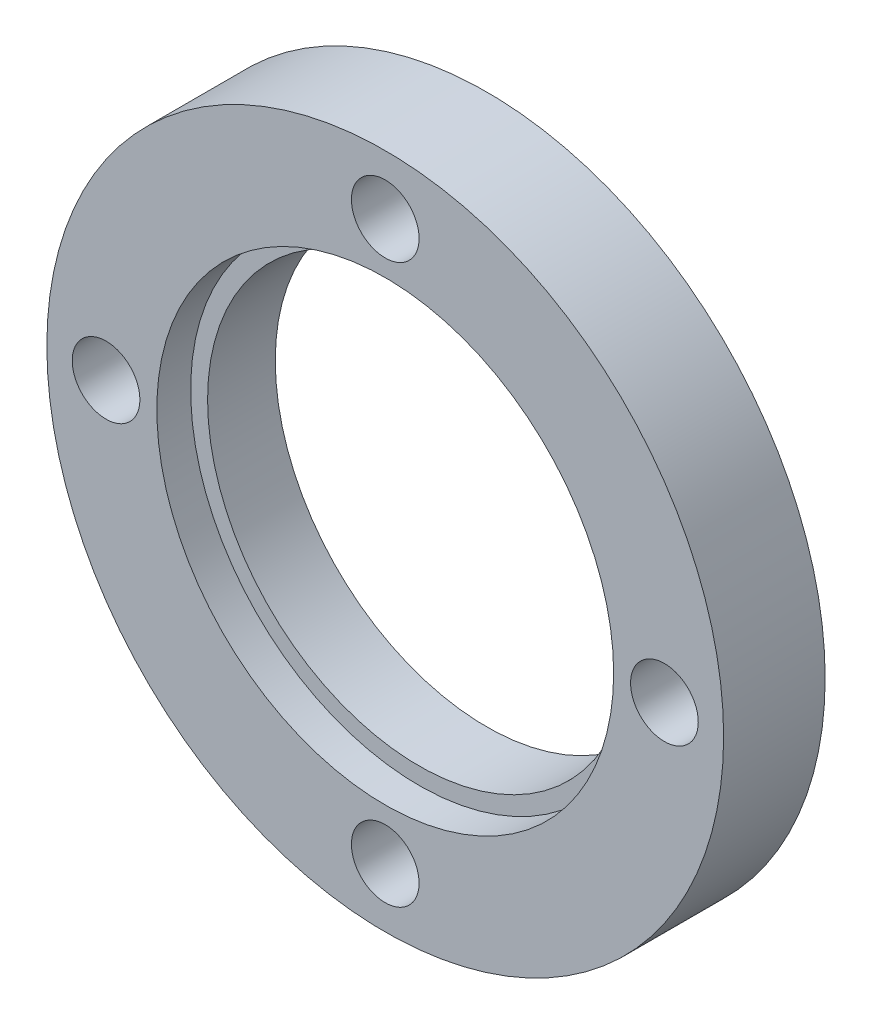
ISO-10303-21;
HEADER;
FILE_DESCRIPTION(('STEP AP214'),'2;1');
FILE_NAME('part.step','',(''),(''),'','','');
FILE_SCHEMA(('AUTOMOTIVE_DESIGN { 1 0 10303 214 1 1 1 1 }'));
ENDSEC;
DATA;
#1=APPLICATION_CONTEXT('core data for automotive mechanical design processes');
#2=APPLICATION_PROTOCOL_DEFINITION('international standard','automotive_design',2000,#1);
#3=PRODUCT_CONTEXT('',#1,'mechanical');
#4=PRODUCT('Part','Part','',(#3));
#5=PRODUCT_RELATED_PRODUCT_CATEGORY('part','',(#4));
#6=PRODUCT_DEFINITION_FORMATION('','',#4);
#7=PRODUCT_DEFINITION_CONTEXT('part definition',#1,'design');
#8=PRODUCT_DEFINITION('design','',#6,#7);
#9=PRODUCT_DEFINITION_SHAPE('','',#8);
#10=(LENGTH_UNIT() NAMED_UNIT(*) SI_UNIT(.MILLI.,.METRE.));
#11=(NAMED_UNIT(*) PLANE_ANGLE_UNIT() SI_UNIT($,.RADIAN.));
#12=(NAMED_UNIT(*) SI_UNIT($,.STERADIAN.) SOLID_ANGLE_UNIT());
#13=UNCERTAINTY_MEASURE_WITH_UNIT(LENGTH_MEASURE(1.E-05),#10,'distance_accuracy_value','');
#14=(GEOMETRIC_REPRESENTATION_CONTEXT(3) GLOBAL_UNCERTAINTY_ASSIGNED_CONTEXT((#13)) GLOBAL_UNIT_ASSIGNED_CONTEXT((#10,
#11,#12)) REPRESENTATION_CONTEXT('',''));
#15=CARTESIAN_POINT('',(0.,0.,0.));
#16=DIRECTION('',(0.,0.,1.));
#17=DIRECTION('',(1.,0.,0.));
#18=AXIS2_PLACEMENT_3D('',#15,#16,#17);
#19=CARTESIAN_POINT('',(0.,0.,12.));
#20=DIRECTION('',(0.,0.,-1.));
#21=DIRECTION('',(-1.,0.,0.));
#22=AXIS2_PLACEMENT_3D('',#19,#20,#21);
#23=CYLINDRICAL_SURFACE('',#22,25.);
#24=CARTESIAN_POINT('',(0.,0.,0.));
#25=DIRECTION('',(0.,0.,-1.));
#26=DIRECTION('',(-1.,0.,0.));
#27=AXIS2_PLACEMENT_3D('',#24,#25,#26);
#28=CIRCLE('',#27,25.);
#29=CARTESIAN_POINT('',(-25.,0.,0.));
#30=VERTEX_POINT('',#29);
#31=EDGE_CURVE('E44',#30,#30,#28,.T.);
#32=ORIENTED_EDGE('',*,*,#31,.T.);
#33=EDGE_LOOP('',(#32));
#34=FACE_BOUND('',#33,.T.);
#35=CARTESIAN_POINT('',(0.,0.,8.));
#36=DIRECTION('',(0.,0.,1.));
#37=DIRECTION('',(1.,0.,0.));
#38=AXIS2_PLACEMENT_3D('',#35,#36,#37);
#39=CIRCLE('',#38,25.);
#40=CARTESIAN_POINT('',(25.,0.,8.));
#41=VERTEX_POINT('',#40);
#42=EDGE_CURVE('E76',#41,#41,#39,.T.);
#43=ORIENTED_EDGE('',*,*,#42,.T.);
#44=EDGE_LOOP('',(#43));
#45=FACE_BOUND('',#44,.T.);
#46=ADVANCED_FACE('F33',(#34,#45),#23,.F.);
#47=CARTESIAN_POINT('',(0.,0.,12.));
#48=DIRECTION('',(0.,0.,-1.));
#49=DIRECTION('',(-1.,0.,0.));
#50=AXIS2_PLACEMENT_3D('',#47,#48,#49);
#51=CYLINDRICAL_SURFACE('',#50,40.);
#52=CARTESIAN_POINT('',(0.,0.,12.));
#53=DIRECTION('',(0.,0.,1.));
#54=DIRECTION('',(1.,0.,0.));
#55=AXIS2_PLACEMENT_3D('',#52,#53,#54);
#56=CIRCLE('',#55,40.);
#57=CARTESIAN_POINT('',(40.,0.,12.));
#58=VERTEX_POINT('',#57);
#59=EDGE_CURVE('E10',#58,#58,#56,.T.);
#60=ORIENTED_EDGE('',*,*,#59,.F.);
#61=EDGE_LOOP('',(#60));
#62=FACE_BOUND('',#61,.T.);
#63=CARTESIAN_POINT('',(0.,0.,0.));
#64=DIRECTION('',(0.,0.,1.));
#65=DIRECTION('',(1.,0.,0.));
#66=AXIS2_PLACEMENT_3D('',#63,#64,#65);
#67=CIRCLE('',#66,40.);
#68=CARTESIAN_POINT('',(40.,0.,0.));
#69=VERTEX_POINT('',#68);
#70=EDGE_CURVE('E37',#69,#69,#67,.T.);
#71=ORIENTED_EDGE('',*,*,#70,.T.);
#72=EDGE_LOOP('',(#71));
#73=FACE_BOUND('',#72,.T.);
#74=ADVANCED_FACE('F35',(#62,#73),#51,.T.);
#75=CARTESIAN_POINT('',(0.,0.,12.));
#76=DIRECTION('',(0.,0.,1.));
#77=DIRECTION('',(1.,0.,0.));
#78=AXIS2_PLACEMENT_3D('',#75,#76,#77);
#79=PLANE('',#78);
#80=CARTESIAN_POINT('',(0.,0.,12.));
#81=DIRECTION('',(0.,0.,1.));
#82=DIRECTION('',(1.,0.,0.));
#83=AXIS2_PLACEMENT_3D('',#80,#81,#82);
#84=CIRCLE('',#83,27.);
#85=CARTESIAN_POINT('',(27.,0.,12.));
#86=VERTEX_POINT('',#85);
#87=EDGE_CURVE('E73',#86,#86,#84,.T.);
#88=ORIENTED_EDGE('',*,*,#87,.F.);
#89=EDGE_LOOP('',(#88));
#90=FACE_BOUND('',#89,.T.);
#91=CARTESIAN_POINT('',(-33.,0.,12.));
#92=DIRECTION('',(0.,0.,1.));
#93=DIRECTION('',(1.,0.,0.));
#94=AXIS2_PLACEMENT_3D('',#91,#92,#93);
#95=CIRCLE('',#94,4.);
#96=CARTESIAN_POINT('',(-29.,0.,12.));
#97=VERTEX_POINT('',#96);
#98=EDGE_CURVE('E68',#97,#97,#95,.T.);
#99=ORIENTED_EDGE('',*,*,#98,.F.);
#100=EDGE_LOOP('',(#99));
#101=FACE_BOUND('',#100,.T.);
#102=CARTESIAN_POINT('',(0.,33.,12.));
#103=DIRECTION('',(0.,0.,1.));
#104=DIRECTION('',(1.,0.,0.));
#105=AXIS2_PLACEMENT_3D('',#102,#103,#104);
#106=CIRCLE('',#105,4.);
#107=CARTESIAN_POINT('',(4.,33.,12.));
#108=VERTEX_POINT('',#107);
#109=EDGE_CURVE('E62',#108,#108,#106,.T.);
#110=ORIENTED_EDGE('',*,*,#109,.F.);
#111=EDGE_LOOP('',(#110));
#112=FACE_BOUND('',#111,.T.);
#113=CARTESIAN_POINT('',(33.,0.,12.));
#114=DIRECTION('',(0.,0.,1.));
#115=DIRECTION('',(1.,0.,0.));
#116=AXIS2_PLACEMENT_3D('',#113,#114,#115);
#117=CIRCLE('',#116,4.);
#118=CARTESIAN_POINT('',(37.,0.,12.));
#119=VERTEX_POINT('',#118);
#120=EDGE_CURVE('E56',#119,#119,#117,.T.);
#121=ORIENTED_EDGE('',*,*,#120,.F.);
#122=EDGE_LOOP('',(#121));
#123=FACE_BOUND('',#122,.T.);
#124=CARTESIAN_POINT('',(0.,-33.,12.));
#125=DIRECTION('',(0.,0.,1.));
#126=DIRECTION('',(1.,0.,0.));
#127=AXIS2_PLACEMENT_3D('',#124,#125,#126);
#128=CIRCLE('',#127,4.);
#129=CARTESIAN_POINT('',(4.00000000000001,-33.,12.));
#130=VERTEX_POINT('',#129);
#131=EDGE_CURVE('E49',#130,#130,#128,.T.);
#132=ORIENTED_EDGE('',*,*,#131,.F.);
#133=EDGE_LOOP('',(#132));
#134=FACE_BOUND('',#133,.T.);
#135=ORIENTED_EDGE('',*,*,#59,.T.);
#136=EDGE_LOOP('',(#135));
#137=FACE_BOUND('',#136,.T.);
#138=ADVANCED_FACE('F96',(#90,#101,#112,#123,#134,#137),#79,.T.);
#139=CARTESIAN_POINT('',(0.,0.,0.));
#140=DIRECTION('',(0.,0.,1.));
#141=DIRECTION('',(1.,0.,0.));
#142=AXIS2_PLACEMENT_3D('',#139,#140,#141);
#143=PLANE('',#142);
#144=CARTESIAN_POINT('',(-33.,0.,0.));
#145=DIRECTION('',(0.,0.,1.));
#146=DIRECTION('',(1.,0.,0.));
#147=AXIS2_PLACEMENT_3D('',#144,#145,#146);
#148=CIRCLE('',#147,4.);
#149=CARTESIAN_POINT('',(-29.,0.,0.));
#150=VERTEX_POINT('',#149);
#151=EDGE_CURVE('E48',#150,#150,#148,.T.);
#152=ORIENTED_EDGE('',*,*,#151,.T.);
#153=EDGE_LOOP('',(#152));
#154=FACE_BOUND('',#153,.T.);
#155=CARTESIAN_POINT('',(0.,33.,0.));
#156=DIRECTION('',(0.,0.,1.));
#157=DIRECTION('',(1.,0.,0.));
#158=AXIS2_PLACEMENT_3D('',#155,#156,#157);
#159=CIRCLE('',#158,4.);
#160=CARTESIAN_POINT('',(4.,33.,0.));
#161=VERTEX_POINT('',#160);
#162=EDGE_CURVE('E65',#161,#161,#159,.T.);
#163=ORIENTED_EDGE('',*,*,#162,.T.);
#164=EDGE_LOOP('',(#163));
#165=FACE_BOUND('',#164,.T.);
#166=CARTESIAN_POINT('',(33.,0.,0.));
#167=DIRECTION('',(0.,0.,1.));
#168=DIRECTION('',(1.,0.,0.));
#169=AXIS2_PLACEMENT_3D('',#166,#167,#168);
#170=CIRCLE('',#169,4.);
#171=CARTESIAN_POINT('',(37.,0.,0.));
#172=VERTEX_POINT('',#171);
#173=EDGE_CURVE('E59',#172,#172,#170,.T.);
#174=ORIENTED_EDGE('',*,*,#173,.T.);
#175=EDGE_LOOP('',(#174));
#176=FACE_BOUND('',#175,.T.);
#177=CARTESIAN_POINT('',(0.,-33.,0.));
#178=DIRECTION('',(0.,0.,1.));
#179=DIRECTION('',(1.,0.,0.));
#180=AXIS2_PLACEMENT_3D('',#177,#178,#179);
#181=CIRCLE('',#180,4.);
#182=CARTESIAN_POINT('',(4.00000000000001,-33.,0.));
#183=VERTEX_POINT('',#182);
#184=EDGE_CURVE('E52',#183,#183,#181,.T.);
#185=ORIENTED_EDGE('',*,*,#184,.T.);
#186=EDGE_LOOP('',(#185));
#187=FACE_BOUND('',#186,.T.);
#188=ORIENTED_EDGE('',*,*,#31,.F.);
#189=EDGE_LOOP('',(#188));
#190=FACE_BOUND('',#189,.T.);
#191=ORIENTED_EDGE('',*,*,#70,.F.);
#192=EDGE_LOOP('',(#191));
#193=FACE_BOUND('',#192,.T.);
#194=ADVANCED_FACE('F99',(#154,#165,#176,#187,#190,#193),#143,.F.);
#195=CARTESIAN_POINT('',(0.,-33.,0.));
#196=DIRECTION('',(0.,0.,1.));
#197=DIRECTION('',(1.,0.,0.));
#198=AXIS2_PLACEMENT_3D('',#195,#196,#197);
#199=CYLINDRICAL_SURFACE('',#198,4.);
#200=ORIENTED_EDGE('',*,*,#184,.F.);
#201=EDGE_LOOP('',(#200));
#202=FACE_BOUND('',#201,.T.);
#203=ORIENTED_EDGE('',*,*,#131,.T.);
#204=EDGE_LOOP('',(#203));
#205=FACE_BOUND('',#204,.T.);
#206=ADVANCED_FACE('F109',(#202,#205),#199,.F.);
#207=CARTESIAN_POINT('',(33.,0.,0.));
#208=DIRECTION('',(0.,0.,1.));
#209=DIRECTION('',(1.,0.,0.));
#210=AXIS2_PLACEMENT_3D('',#207,#208,#209);
#211=CYLINDRICAL_SURFACE('',#210,4.);
#212=ORIENTED_EDGE('',*,*,#173,.F.);
#213=EDGE_LOOP('',(#212));
#214=FACE_BOUND('',#213,.T.);
#215=ORIENTED_EDGE('',*,*,#120,.T.);
#216=EDGE_LOOP('',(#215));
#217=FACE_BOUND('',#216,.T.);
#218=ADVANCED_FACE('F111',(#214,#217),#211,.F.);
#219=CARTESIAN_POINT('',(0.,33.,0.));
#220=DIRECTION('',(0.,0.,1.));
#221=DIRECTION('',(1.,0.,0.));
#222=AXIS2_PLACEMENT_3D('',#219,#220,#221);
#223=CYLINDRICAL_SURFACE('',#222,4.);
#224=ORIENTED_EDGE('',*,*,#162,.F.);
#225=EDGE_LOOP('',(#224));
#226=FACE_BOUND('',#225,.T.);
#227=ORIENTED_EDGE('',*,*,#109,.T.);
#228=EDGE_LOOP('',(#227));
#229=FACE_BOUND('',#228,.T.);
#230=ADVANCED_FACE('F118',(#226,#229),#223,.F.);
#231=CARTESIAN_POINT('',(-33.,0.,0.));
#232=DIRECTION('',(0.,0.,1.));
#233=DIRECTION('',(1.,0.,0.));
#234=AXIS2_PLACEMENT_3D('',#231,#232,#233);
#235=CYLINDRICAL_SURFACE('',#234,4.);
#236=ORIENTED_EDGE('',*,*,#151,.F.);
#237=EDGE_LOOP('',(#236));
#238=FACE_BOUND('',#237,.T.);
#239=ORIENTED_EDGE('',*,*,#98,.T.);
#240=EDGE_LOOP('',(#239));
#241=FACE_BOUND('',#240,.T.);
#242=ADVANCED_FACE('F92',(#238,#241),#235,.F.);
#243=CARTESIAN_POINT('',(0.,0.,8.));
#244=DIRECTION('',(0.,0.,1.));
#245=DIRECTION('',(1.,0.,0.));
#246=AXIS2_PLACEMENT_3D('',#243,#244,#245);
#247=CYLINDRICAL_SURFACE('',#246,27.);
#248=CARTESIAN_POINT('',(0.,0.,8.));
#249=DIRECTION('',(0.,0.,1.));
#250=DIRECTION('',(1.,0.,0.));
#251=AXIS2_PLACEMENT_3D('',#248,#249,#250);
#252=CIRCLE('',#251,27.);
#253=CARTESIAN_POINT('',(27.,0.,8.));
#254=VERTEX_POINT('',#253);
#255=EDGE_CURVE('E53',#254,#254,#252,.T.);
#256=ORIENTED_EDGE('',*,*,#255,.F.);
#257=EDGE_LOOP('',(#256));
#258=FACE_BOUND('',#257,.T.);
#259=ORIENTED_EDGE('',*,*,#87,.T.);
#260=EDGE_LOOP('',(#259));
#261=FACE_BOUND('',#260,.T.);
#262=ADVANCED_FACE('F86',(#258,#261),#247,.F.);
#263=CARTESIAN_POINT('',(0.,0.,8.));
#264=DIRECTION('',(0.,0.,1.));
#265=DIRECTION('',(1.,0.,0.));
#266=AXIS2_PLACEMENT_3D('',#263,#264,#265);
#267=PLANE('',#266);
#268=ORIENTED_EDGE('',*,*,#42,.F.);
#269=EDGE_LOOP('',(#268));
#270=FACE_BOUND('',#269,.T.);
#271=ORIENTED_EDGE('',*,*,#255,.T.);
#272=EDGE_LOOP('',(#271));
#273=FACE_BOUND('',#272,.T.);
#274=ADVANCED_FACE('F83',(#270,#273),#267,.T.);
#275=CLOSED_SHELL('',(#46,#74,#138,#194,#206,#218,#230,#242,#262,#274));
#276=MANIFOLD_SOLID_BREP('B2',#275);
#277=ADVANCED_BREP_SHAPE_REPRESENTATION('',(#18,#276),#14);
#278=SHAPE_DEFINITION_REPRESENTATION(#9,#277);
ENDSEC;
END-ISO-10303-21;
